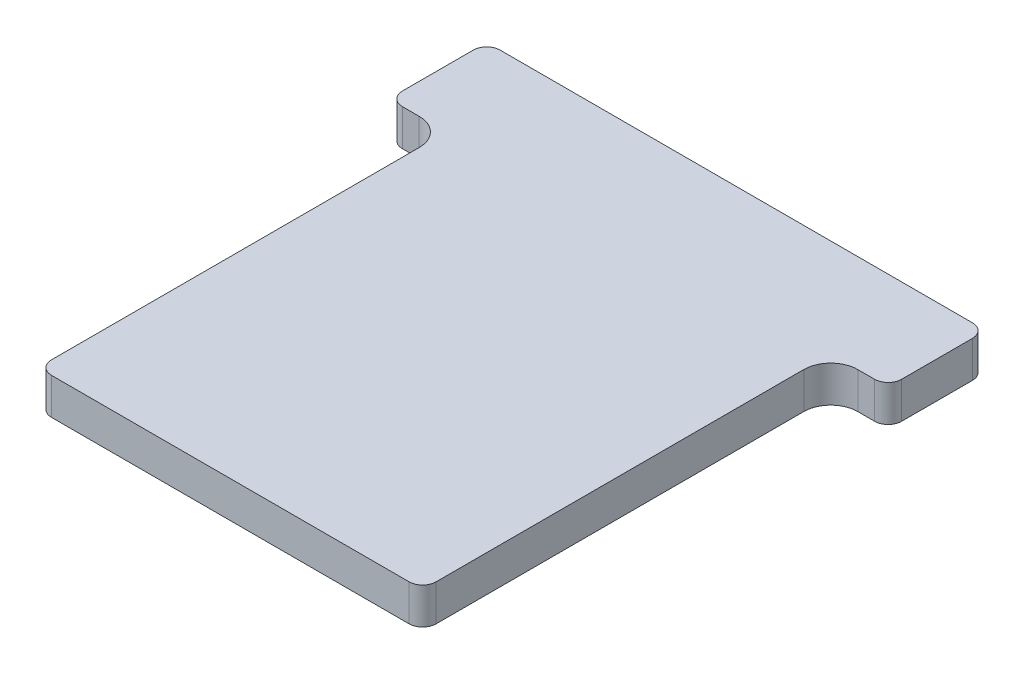
ISO-10303-21;
HEADER;
FILE_DESCRIPTION(('STEP AP214'),'2;1');
FILE_NAME('part.step','',(''),(''),'','','');
FILE_SCHEMA(('AUTOMOTIVE_DESIGN { 1 0 10303 214 1 1 1 1 }'));
ENDSEC;
DATA;
#1=APPLICATION_CONTEXT('core data for automotive mechanical design processes');
#2=APPLICATION_PROTOCOL_DEFINITION('international standard','automotive_design',2000,#1);
#3=PRODUCT_CONTEXT('',#1,'mechanical');
#4=PRODUCT('Part','Part','',(#3));
#5=PRODUCT_RELATED_PRODUCT_CATEGORY('part','',(#4));
#6=PRODUCT_DEFINITION_FORMATION('','',#4);
#7=PRODUCT_DEFINITION_CONTEXT('part definition',#1,'design');
#8=PRODUCT_DEFINITION('design','',#6,#7);
#9=PRODUCT_DEFINITION_SHAPE('','',#8);
#10=(LENGTH_UNIT() NAMED_UNIT(*) SI_UNIT(.MILLI.,.METRE.));
#11=(NAMED_UNIT(*) PLANE_ANGLE_UNIT() SI_UNIT($,.RADIAN.));
#12=(NAMED_UNIT(*) SI_UNIT($,.STERADIAN.) SOLID_ANGLE_UNIT());
#13=UNCERTAINTY_MEASURE_WITH_UNIT(LENGTH_MEASURE(1.E-05),#10,'distance_accuracy_value','');
#14=(GEOMETRIC_REPRESENTATION_CONTEXT(3) GLOBAL_UNCERTAINTY_ASSIGNED_CONTEXT((#13)) GLOBAL_UNIT_ASSIGNED_CONTEXT((#10,
#11,#12)) REPRESENTATION_CONTEXT('',''));
#15=CARTESIAN_POINT('',(0.,0.,0.));
#16=DIRECTION('',(0.,0.,1.));
#17=DIRECTION('',(1.,0.,0.));
#18=AXIS2_PLACEMENT_3D('',#15,#16,#17);
#19=CARTESIAN_POINT('',(14.25,2.7,-15.125));
#20=DIRECTION('',(0.,0.,-1.));
#21=DIRECTION('',(-1.,0.,0.));
#22=AXIS2_PLACEMENT_3D('',#19,#20,#21);
#23=PLANE('',#22);
#24=DIRECTION('',(1.,0.,0.));
#25=VECTOR('',#24,1.);
#26=CARTESIAN_POINT('',(14.25,2.7,-15.125));
#27=LINE('',#26,#25);
#28=CARTESIAN_POINT('',(16.25,2.7,-15.125));
#29=VERTEX_POINT('',#28);
#30=CARTESIAN_POINT('',(17.5,2.7,-15.125));
#31=VERTEX_POINT('',#30);
#32=EDGE_CURVE('E171',#29,#31,#27,.T.);
#33=ORIENTED_EDGE('',*,*,#32,.F.);
#34=DIRECTION('',(0.,-1.,0.));
#35=VECTOR('',#34,1.);
#36=CARTESIAN_POINT('',(16.25,0.,-15.125));
#37=LINE('',#36,#35);
#38=CARTESIAN_POINT('',(16.25,0.,-15.125));
#39=VERTEX_POINT('',#38);
#40=EDGE_CURVE('E229',#29,#39,#37,.T.);
#41=ORIENTED_EDGE('',*,*,#40,.T.);
#42=DIRECTION('',(1.,0.,0.));
#43=VECTOR('',#42,1.);
#44=CARTESIAN_POINT('',(14.25,0.,-15.125));
#45=LINE('',#44,#43);
#46=CARTESIAN_POINT('',(17.5,0.,-15.125));
#47=VERTEX_POINT('',#46);
#48=EDGE_CURVE('E309',#39,#47,#45,.T.);
#49=ORIENTED_EDGE('',*,*,#48,.T.);
#50=DIRECTION('',(0.,-1.,0.));
#51=VECTOR('',#50,1.);
#52=CARTESIAN_POINT('',(17.5,2.7,-15.125));
#53=LINE('',#52,#51);
#54=EDGE_CURVE('E218',#47,#31,#53,.F.);
#55=ORIENTED_EDGE('',*,*,#54,.T.);
#56=EDGE_LOOP('',(#33,#41,#49,#55));
#57=FACE_BOUND('',#56,.T.);
#58=ADVANCED_FACE('F33',(#57),#23,.F.);
#59=CARTESIAN_POINT('',(18.5,2.7,-22.375));
#60=DIRECTION('',(-1.,0.,0.));
#61=DIRECTION('',(0.,0.,1.));
#62=AXIS2_PLACEMENT_3D('',#59,#60,#61);
#63=PLANE('',#62);
#64=DIRECTION('',(0.,0.,-1.));
#65=VECTOR('',#64,1.);
#66=CARTESIAN_POINT('',(18.5,0.,-22.375));
#67=LINE('',#66,#65);
#68=CARTESIAN_POINT('',(18.5,0.,-16.125));
#69=VERTEX_POINT('',#68);
#70=CARTESIAN_POINT('',(18.5,0.,-21.375));
#71=VERTEX_POINT('',#70);
#72=EDGE_CURVE('E311',#69,#71,#67,.T.);
#73=ORIENTED_EDGE('',*,*,#72,.T.);
#74=DIRECTION('',(0.,-1.,0.));
#75=VECTOR('',#74,1.);
#76=CARTESIAN_POINT('',(18.5,2.7,-21.375));
#77=LINE('',#76,#75);
#78=CARTESIAN_POINT('',(18.5,2.7,-21.375));
#79=VERTEX_POINT('',#78);
#80=EDGE_CURVE('E216',#71,#79,#77,.F.);
#81=ORIENTED_EDGE('',*,*,#80,.T.);
#82=DIRECTION('',(0.,0.,-1.));
#83=VECTOR('',#82,1.);
#84=CARTESIAN_POINT('',(18.5,2.7,-22.375));
#85=LINE('',#84,#83);
#86=CARTESIAN_POINT('',(18.5,2.7,-16.125));
#87=VERTEX_POINT('',#86);
#88=EDGE_CURVE('E174',#87,#79,#85,.T.);
#89=ORIENTED_EDGE('',*,*,#88,.F.);
#90=DIRECTION('',(0.,-1.,0.));
#91=VECTOR('',#90,1.);
#92=CARTESIAN_POINT('',(18.5,2.7,-16.125));
#93=LINE('',#92,#91);
#94=EDGE_CURVE('E213',#87,#69,#93,.T.);
#95=ORIENTED_EDGE('',*,*,#94,.T.);
#96=EDGE_LOOP('',(#73,#81,#89,#95));
#97=FACE_BOUND('',#96,.T.);
#98=ADVANCED_FACE('F262',(#97),#63,.F.);
#99=CARTESIAN_POINT('',(-18.5,2.7,-22.375));
#100=DIRECTION('',(0.,0.,1.));
#101=DIRECTION('',(1.,0.,0.));
#102=AXIS2_PLACEMENT_3D('',#99,#100,#101);
#103=PLANE('',#102);
#104=DIRECTION('',(-1.,0.,0.));
#105=VECTOR('',#104,1.);
#106=CARTESIAN_POINT('',(-18.5,2.7,-22.375));
#107=LINE('',#106,#105);
#108=CARTESIAN_POINT('',(17.5,2.7,-22.375));
#109=VERTEX_POINT('',#108);
#110=CARTESIAN_POINT('',(-17.5,2.7,-22.375));
#111=VERTEX_POINT('',#110);
#112=EDGE_CURVE('E303',#109,#111,#107,.T.);
#113=ORIENTED_EDGE('',*,*,#112,.F.);
#114=DIRECTION('',(0.,-1.,0.));
#115=VECTOR('',#114,1.);
#116=CARTESIAN_POINT('',(17.5,2.7,-22.375));
#117=LINE('',#116,#115);
#118=CARTESIAN_POINT('',(17.5,0.,-22.375));
#119=VERTEX_POINT('',#118);
#120=EDGE_CURVE('E210',#109,#119,#117,.T.);
#121=ORIENTED_EDGE('',*,*,#120,.T.);
#122=DIRECTION('',(-1.,0.,0.));
#123=VECTOR('',#122,1.);
#124=CARTESIAN_POINT('',(-18.5,0.,-22.375));
#125=LINE('',#124,#123);
#126=CARTESIAN_POINT('',(-17.5,0.,-22.375));
#127=VERTEX_POINT('',#126);
#128=EDGE_CURVE('E314',#119,#127,#125,.T.);
#129=ORIENTED_EDGE('',*,*,#128,.T.);
#130=DIRECTION('',(0.,-1.,0.));
#131=VECTOR('',#130,1.);
#132=CARTESIAN_POINT('',(-17.5,2.7,-22.375));
#133=LINE('',#132,#131);
#134=EDGE_CURVE('E208',#127,#111,#133,.F.);
#135=ORIENTED_EDGE('',*,*,#134,.T.);
#136=EDGE_LOOP('',(#113,#121,#129,#135));
#137=FACE_BOUND('',#136,.T.);
#138=ADVANCED_FACE('F267',(#137),#103,.F.);
#139=CARTESIAN_POINT('',(-18.5,2.7,-22.375));
#140=DIRECTION('',(1.,0.,0.));
#141=DIRECTION('',(0.,0.,-1.));
#142=AXIS2_PLACEMENT_3D('',#139,#140,#141);
#143=PLANE('',#142);
#144=DIRECTION('',(0.,0.,1.));
#145=VECTOR('',#144,1.);
#146=CARTESIAN_POINT('',(-18.5,0.,-22.375));
#147=LINE('',#146,#145);
#148=CARTESIAN_POINT('',(-18.5,0.,-21.375));
#149=VERTEX_POINT('',#148);
#150=CARTESIAN_POINT('',(-18.5,0.,-16.125));
#151=VERTEX_POINT('',#150);
#152=EDGE_CURVE('E317',#149,#151,#147,.T.);
#153=ORIENTED_EDGE('',*,*,#152,.T.);
#154=DIRECTION('',(0.,-1.,0.));
#155=VECTOR('',#154,1.);
#156=CARTESIAN_POINT('',(-18.5,2.7,-16.125));
#157=LINE('',#156,#155);
#158=CARTESIAN_POINT('',(-18.5,2.7,-16.125));
#159=VERTEX_POINT('',#158);
#160=EDGE_CURVE('E227',#151,#159,#157,.F.);
#161=ORIENTED_EDGE('',*,*,#160,.T.);
#162=DIRECTION('',(0.,0.,1.));
#163=VECTOR('',#162,1.);
#164=CARTESIAN_POINT('',(-18.5,2.7,-22.375));
#165=LINE('',#164,#163);
#166=CARTESIAN_POINT('',(-18.5,2.7,-21.375));
#167=VERTEX_POINT('',#166);
#168=EDGE_CURVE('E297',#167,#159,#165,.T.);
#169=ORIENTED_EDGE('',*,*,#168,.F.);
#170=DIRECTION('',(0.,-1.,0.));
#171=VECTOR('',#170,1.);
#172=CARTESIAN_POINT('',(-18.5,2.7,-21.375));
#173=LINE('',#172,#171);
#174=EDGE_CURVE('E224',#167,#149,#173,.T.);
#175=ORIENTED_EDGE('',*,*,#174,.T.);
#176=EDGE_LOOP('',(#153,#161,#169,#175));
#177=FACE_BOUND('',#176,.T.);
#178=ADVANCED_FACE('F343',(#177),#143,.F.);
#179=CARTESIAN_POINT('',(-14.25,2.7,-15.125));
#180=DIRECTION('',(0.,0.,-1.));
#181=DIRECTION('',(-1.,0.,0.));
#182=AXIS2_PLACEMENT_3D('',#179,#180,#181);
#183=PLANE('',#182);
#184=DIRECTION('',(1.,0.,0.));
#185=VECTOR('',#184,1.);
#186=CARTESIAN_POINT('',(-14.25,0.,-15.125));
#187=LINE('',#186,#185);
#188=CARTESIAN_POINT('',(-17.5,0.,-15.125));
#189=VERTEX_POINT('',#188);
#190=CARTESIAN_POINT('',(-16.25,0.,-15.125));
#191=VERTEX_POINT('',#190);
#192=EDGE_CURVE('E320',#189,#191,#187,.T.);
#193=ORIENTED_EDGE('',*,*,#192,.T.);
#194=DIRECTION('',(0.,-1.,0.));
#195=VECTOR('',#194,1.);
#196=CARTESIAN_POINT('',(-16.25,2.7,-15.125));
#197=LINE('',#196,#195);
#198=CARTESIAN_POINT('',(-16.25,2.7,-15.125));
#199=VERTEX_POINT('',#198);
#200=EDGE_CURVE('E54',#191,#199,#197,.F.);
#201=ORIENTED_EDGE('',*,*,#200,.T.);
#202=DIRECTION('',(1.,0.,0.));
#203=VECTOR('',#202,1.);
#204=CARTESIAN_POINT('',(-14.25,2.7,-15.125));
#205=LINE('',#204,#203);
#206=CARTESIAN_POINT('',(-17.5,2.7,-15.125));
#207=VERTEX_POINT('',#206);
#208=EDGE_CURVE('E294',#207,#199,#205,.T.);
#209=ORIENTED_EDGE('',*,*,#208,.F.);
#210=DIRECTION('',(0.,-1.,0.));
#211=VECTOR('',#210,1.);
#212=CARTESIAN_POINT('',(-17.5,2.7,-15.125));
#213=LINE('',#212,#211);
#214=EDGE_CURVE('E221',#207,#189,#213,.T.);
#215=ORIENTED_EDGE('',*,*,#214,.T.);
#216=EDGE_LOOP('',(#193,#201,#209,#215));
#217=FACE_BOUND('',#216,.T.);
#218=ADVANCED_FACE('F298',(#217),#183,.F.);
#219=CARTESIAN_POINT('',(-14.25,2.7,15.125));
#220=DIRECTION('',(1.,0.,0.));
#221=DIRECTION('',(0.,0.,-1.));
#222=AXIS2_PLACEMENT_3D('',#219,#220,#221);
#223=PLANE('',#222);
#224=DIRECTION('',(0.,0.,1.));
#225=VECTOR('',#224,1.);
#226=CARTESIAN_POINT('',(-14.25,2.7,15.125));
#227=LINE('',#226,#225);
#228=CARTESIAN_POINT('',(-14.25,2.7,-13.125));
#229=VERTEX_POINT('',#228);
#230=CARTESIAN_POINT('',(-14.25,2.7,14.125));
#231=VERTEX_POINT('',#230);
#232=EDGE_CURVE('E299',#229,#231,#227,.T.);
#233=ORIENTED_EDGE('',*,*,#232,.F.);
#234=DIRECTION('',(0.,-1.,0.));
#235=VECTOR('',#234,1.);
#236=CARTESIAN_POINT('',(-14.25,0.,-13.125));
#237=LINE('',#236,#235);
#238=CARTESIAN_POINT('',(-14.25,0.,-13.125));
#239=VERTEX_POINT('',#238);
#240=EDGE_CURVE('E234',#229,#239,#237,.T.);
#241=ORIENTED_EDGE('',*,*,#240,.T.);
#242=DIRECTION('',(0.,0.,1.));
#243=VECTOR('',#242,1.);
#244=CARTESIAN_POINT('',(-14.25,0.,15.125));
#245=LINE('',#244,#243);
#246=CARTESIAN_POINT('',(-14.25,0.,14.125));
#247=VERTEX_POINT('',#246);
#248=EDGE_CURVE('E176',#239,#247,#245,.T.);
#249=ORIENTED_EDGE('',*,*,#248,.T.);
#250=DIRECTION('',(0.,-1.,0.));
#251=VECTOR('',#250,1.);
#252=CARTESIAN_POINT('',(-14.25,2.7,14.125));
#253=LINE('',#252,#251);
#254=EDGE_CURVE('E205',#247,#231,#253,.F.);
#255=ORIENTED_EDGE('',*,*,#254,.T.);
#256=EDGE_LOOP('',(#233,#241,#249,#255));
#257=FACE_BOUND('',#256,.T.);
#258=ADVANCED_FACE('F323',(#257),#223,.F.);
#259=CARTESIAN_POINT('',(-14.25,2.7,15.125));
#260=DIRECTION('',(0.,0.,-1.));
#261=DIRECTION('',(-1.,0.,0.));
#262=AXIS2_PLACEMENT_3D('',#259,#260,#261);
#263=PLANE('',#262);
#264=DIRECTION('',(1.,0.,0.));
#265=VECTOR('',#264,1.);
#266=CARTESIAN_POINT('',(-14.25,0.,15.125));
#267=LINE('',#266,#265);
#268=CARTESIAN_POINT('',(-13.25,0.,15.125));
#269=VERTEX_POINT('',#268);
#270=CARTESIAN_POINT('',(13.25,0.,15.125));
#271=VERTEX_POINT('',#270);
#272=EDGE_CURVE('E172',#269,#271,#267,.T.);
#273=ORIENTED_EDGE('',*,*,#272,.T.);
#274=DIRECTION('',(0.,-1.,0.));
#275=VECTOR('',#274,1.);
#276=CARTESIAN_POINT('',(13.25,2.7,15.125));
#277=LINE('',#276,#275);
#278=CARTESIAN_POINT('',(13.25,2.7,15.125));
#279=VERTEX_POINT('',#278);
#280=EDGE_CURVE('E151',#271,#279,#277,.F.);
#281=ORIENTED_EDGE('',*,*,#280,.T.);
#282=DIRECTION('',(1.,0.,0.));
#283=VECTOR('',#282,1.);
#284=CARTESIAN_POINT('',(-14.25,2.7,15.125));
#285=LINE('',#284,#283);
#286=CARTESIAN_POINT('',(-13.25,2.7,15.125));
#287=VERTEX_POINT('',#286);
#288=EDGE_CURVE('E301',#287,#279,#285,.T.);
#289=ORIENTED_EDGE('',*,*,#288,.F.);
#290=DIRECTION('',(0.,-1.,0.));
#291=VECTOR('',#290,1.);
#292=CARTESIAN_POINT('',(-13.25,2.7,15.125));
#293=LINE('',#292,#291);
#294=EDGE_CURVE('E155',#287,#269,#293,.T.);
#295=ORIENTED_EDGE('',*,*,#294,.T.);
#296=EDGE_LOOP('',(#273,#281,#289,#295));
#297=FACE_BOUND('',#296,.T.);
#298=ADVANCED_FACE('F330',(#297),#263,.F.);
#299=CARTESIAN_POINT('',(14.25,2.7,15.125));
#300=DIRECTION('',(-1.,0.,0.));
#301=DIRECTION('',(0.,0.,1.));
#302=AXIS2_PLACEMENT_3D('',#299,#300,#301);
#303=PLANE('',#302);
#304=DIRECTION('',(0.,0.,-1.));
#305=VECTOR('',#304,1.);
#306=CARTESIAN_POINT('',(14.25,0.,15.125));
#307=LINE('',#306,#305);
#308=CARTESIAN_POINT('',(14.25,0.,14.125));
#309=VERTEX_POINT('',#308);
#310=CARTESIAN_POINT('',(14.25,0.,-13.125));
#311=VERTEX_POINT('',#310);
#312=EDGE_CURVE('E162',#309,#311,#307,.T.);
#313=ORIENTED_EDGE('',*,*,#312,.T.);
#314=DIRECTION('',(0.,-1.,0.));
#315=VECTOR('',#314,1.);
#316=CARTESIAN_POINT('',(14.25,2.7,-13.125));
#317=LINE('',#316,#315);
#318=CARTESIAN_POINT('',(14.25,2.7,-13.125));
#319=VERTEX_POINT('',#318);
#320=EDGE_CURVE('E232',#311,#319,#317,.F.);
#321=ORIENTED_EDGE('',*,*,#320,.T.);
#322=DIRECTION('',(0.,0.,-1.));
#323=VECTOR('',#322,1.);
#324=CARTESIAN_POINT('',(14.25,2.7,15.125));
#325=LINE('',#324,#323);
#326=CARTESIAN_POINT('',(14.25,2.7,14.125));
#327=VERTEX_POINT('',#326);
#328=EDGE_CURVE('E165',#327,#319,#325,.T.);
#329=ORIENTED_EDGE('',*,*,#328,.F.);
#330=DIRECTION('',(0.,-1.,0.));
#331=VECTOR('',#330,1.);
#332=CARTESIAN_POINT('',(14.25,2.7,14.125));
#333=LINE('',#332,#331);
#334=EDGE_CURVE('E150',#327,#309,#333,.T.);
#335=ORIENTED_EDGE('',*,*,#334,.T.);
#336=EDGE_LOOP('',(#313,#321,#329,#335));
#337=FACE_BOUND('',#336,.T.);
#338=ADVANCED_FACE('F161',(#337),#303,.F.);
#339=CARTESIAN_POINT('',(18.5,2.7,-15.125));
#340=DIRECTION('',(0.,-1.,0.));
#341=DIRECTION('',(0.,0.,-1.));
#342=AXIS2_PLACEMENT_3D('',#339,#340,#341);
#343=PLANE('',#342);
#344=ORIENTED_EDGE('',*,*,#288,.T.);
#345=CARTESIAN_POINT('',(13.25,2.7,14.125));
#346=DIRECTION('',(0.,-1.,0.));
#347=DIRECTION('',(0.,0.,-1.));
#348=AXIS2_PLACEMENT_3D('',#345,#346,#347);
#349=CIRCLE('',#348,1.);
#350=EDGE_CURVE('E203',#279,#327,#349,.F.);
#351=ORIENTED_EDGE('',*,*,#350,.T.);
#352=ORIENTED_EDGE('',*,*,#328,.T.);
#353=CARTESIAN_POINT('',(16.25,2.7,-13.125));
#354=DIRECTION('',(0.,-1.,0.));
#355=DIRECTION('',(0.,0.,-1.));
#356=AXIS2_PLACEMENT_3D('',#353,#354,#355);
#357=CIRCLE('',#356,2.);
#358=EDGE_CURVE('E239',#319,#29,#357,.T.);
#359=ORIENTED_EDGE('',*,*,#358,.T.);
#360=ORIENTED_EDGE('',*,*,#32,.T.);
#361=CARTESIAN_POINT('',(17.5,2.7,-16.125));
#362=DIRECTION('',(0.,-1.,0.));
#363=DIRECTION('',(0.,0.,-1.));
#364=AXIS2_PLACEMENT_3D('',#361,#362,#363);
#365=CIRCLE('',#364,1.);
#366=EDGE_CURVE('E197',#31,#87,#365,.F.);
#367=ORIENTED_EDGE('',*,*,#366,.T.);
#368=ORIENTED_EDGE('',*,*,#88,.T.);
#369=CARTESIAN_POINT('',(17.5,2.7,-21.375));
#370=DIRECTION('',(0.,-1.,0.));
#371=DIRECTION('',(0.,0.,-1.));
#372=AXIS2_PLACEMENT_3D('',#369,#370,#371);
#373=CIRCLE('',#372,1.);
#374=EDGE_CURVE('E199',#79,#109,#373,.F.);
#375=ORIENTED_EDGE('',*,*,#374,.T.);
#376=ORIENTED_EDGE('',*,*,#112,.T.);
#377=CARTESIAN_POINT('',(-17.5,2.7,-21.375));
#378=DIRECTION('',(0.,-1.,0.));
#379=DIRECTION('',(0.,0.,-1.));
#380=AXIS2_PLACEMENT_3D('',#377,#378,#379);
#381=CIRCLE('',#380,1.);
#382=EDGE_CURVE('E193',#111,#167,#381,.F.);
#383=ORIENTED_EDGE('',*,*,#382,.T.);
#384=ORIENTED_EDGE('',*,*,#168,.T.);
#385=CARTESIAN_POINT('',(-17.5,2.7,-16.125));
#386=DIRECTION('',(0.,-1.,0.));
#387=DIRECTION('',(0.,0.,-1.));
#388=AXIS2_PLACEMENT_3D('',#385,#386,#387);
#389=CIRCLE('',#388,1.);
#390=EDGE_CURVE('E195',#159,#207,#389,.F.);
#391=ORIENTED_EDGE('',*,*,#390,.T.);
#392=ORIENTED_EDGE('',*,*,#208,.T.);
#393=CARTESIAN_POINT('',(-16.25,2.7,-13.125));
#394=DIRECTION('',(0.,-1.,0.));
#395=DIRECTION('',(0.,0.,-1.));
#396=AXIS2_PLACEMENT_3D('',#393,#394,#395);
#397=CIRCLE('',#396,2.);
#398=EDGE_CURVE('E11',#199,#229,#397,.T.);
#399=ORIENTED_EDGE('',*,*,#398,.T.);
#400=ORIENTED_EDGE('',*,*,#232,.T.);
#401=CARTESIAN_POINT('',(-13.25,2.7,14.125));
#402=DIRECTION('',(0.,-1.,0.));
#403=DIRECTION('',(0.,0.,-1.));
#404=AXIS2_PLACEMENT_3D('',#401,#402,#403);
#405=CIRCLE('',#404,1.);
#406=EDGE_CURVE('E201',#231,#287,#405,.F.);
#407=ORIENTED_EDGE('',*,*,#406,.T.);
#408=EDGE_LOOP('',(#344,#351,#352,#359,#360,#367,#368,#375,#376,#383,#384,#391,#392,#399,#400,#407));
#409=FACE_BOUND('',#408,.T.);
#410=ADVANCED_FACE('F244',(#409),#343,.F.);
#411=CARTESIAN_POINT('',(18.5,0.,-15.125));
#412=DIRECTION('',(0.,-1.,0.));
#413=DIRECTION('',(0.,0.,-1.));
#414=AXIS2_PLACEMENT_3D('',#411,#412,#413);
#415=PLANE('',#414);
#416=ORIENTED_EDGE('',*,*,#312,.F.);
#417=CARTESIAN_POINT('',(13.25,0.,14.125));
#418=DIRECTION('',(0.,-1.,0.));
#419=DIRECTION('',(0.,0.,-1.));
#420=AXIS2_PLACEMENT_3D('',#417,#418,#419);
#421=CIRCLE('',#420,1.);
#422=EDGE_CURVE('E146',#309,#271,#421,.T.);
#423=ORIENTED_EDGE('',*,*,#422,.T.);
#424=ORIENTED_EDGE('',*,*,#272,.F.);
#425=CARTESIAN_POINT('',(-13.25,0.,14.125));
#426=DIRECTION('',(0.,-1.,0.));
#427=DIRECTION('',(0.,0.,-1.));
#428=AXIS2_PLACEMENT_3D('',#425,#426,#427);
#429=CIRCLE('',#428,1.);
#430=EDGE_CURVE('E156',#269,#247,#429,.T.);
#431=ORIENTED_EDGE('',*,*,#430,.T.);
#432=ORIENTED_EDGE('',*,*,#248,.F.);
#433=CARTESIAN_POINT('',(-16.25,0.,-13.125));
#434=DIRECTION('',(0.,-1.,0.));
#435=DIRECTION('',(0.,0.,-1.));
#436=AXIS2_PLACEMENT_3D('',#433,#434,#435);
#437=CIRCLE('',#436,2.);
#438=EDGE_CURVE('E41',#239,#191,#437,.F.);
#439=ORIENTED_EDGE('',*,*,#438,.T.);
#440=ORIENTED_EDGE('',*,*,#192,.F.);
#441=CARTESIAN_POINT('',(-17.5,0.,-16.125));
#442=DIRECTION('',(0.,-1.,0.));
#443=DIRECTION('',(0.,0.,-1.));
#444=AXIS2_PLACEMENT_3D('',#441,#442,#443);
#445=CIRCLE('',#444,1.);
#446=EDGE_CURVE('E181',#189,#151,#445,.T.);
#447=ORIENTED_EDGE('',*,*,#446,.T.);
#448=ORIENTED_EDGE('',*,*,#152,.F.);
#449=CARTESIAN_POINT('',(-17.5,0.,-21.375));
#450=DIRECTION('',(0.,-1.,0.));
#451=DIRECTION('',(0.,0.,-1.));
#452=AXIS2_PLACEMENT_3D('',#449,#450,#451);
#453=CIRCLE('',#452,1.);
#454=EDGE_CURVE('E166',#149,#127,#453,.T.);
#455=ORIENTED_EDGE('',*,*,#454,.T.);
#456=ORIENTED_EDGE('',*,*,#128,.F.);
#457=CARTESIAN_POINT('',(17.5,0.,-21.375));
#458=DIRECTION('',(0.,-1.,0.));
#459=DIRECTION('',(0.,0.,-1.));
#460=AXIS2_PLACEMENT_3D('',#457,#458,#459);
#461=CIRCLE('',#460,1.);
#462=EDGE_CURVE('E186',#119,#71,#461,.T.);
#463=ORIENTED_EDGE('',*,*,#462,.T.);
#464=ORIENTED_EDGE('',*,*,#72,.F.);
#465=CARTESIAN_POINT('',(17.5,0.,-16.125));
#466=DIRECTION('',(0.,-1.,0.));
#467=DIRECTION('',(0.,0.,-1.));
#468=AXIS2_PLACEMENT_3D('',#465,#466,#467);
#469=CIRCLE('',#468,1.);
#470=EDGE_CURVE('E183',#69,#47,#469,.T.);
#471=ORIENTED_EDGE('',*,*,#470,.T.);
#472=ORIENTED_EDGE('',*,*,#48,.F.);
#473=CARTESIAN_POINT('',(16.25,0.,-13.125));
#474=DIRECTION('',(0.,-1.,0.));
#475=DIRECTION('',(0.,0.,-1.));
#476=AXIS2_PLACEMENT_3D('',#473,#474,#475);
#477=CIRCLE('',#476,2.);
#478=EDGE_CURVE('E170',#39,#311,#477,.F.);
#479=ORIENTED_EDGE('',*,*,#478,.T.);
#480=EDGE_LOOP('',(#416,#423,#424,#431,#432,#439,#440,#447,#448,#455,#456,#463,#464,#471,#472,#479));
#481=FACE_BOUND('',#480,.T.);
#482=ADVANCED_FACE('F168',(#481),#415,.T.);
#483=CARTESIAN_POINT('',(13.25,2.7,14.125));
#484=DIRECTION('',(0.,-1.,0.));
#485=DIRECTION('',(0.,0.,-1.));
#486=AXIS2_PLACEMENT_3D('',#483,#484,#485);
#487=CYLINDRICAL_SURFACE('',#486,1.);
#488=ORIENTED_EDGE('',*,*,#350,.F.);
#489=ORIENTED_EDGE('',*,*,#280,.F.);
#490=ORIENTED_EDGE('',*,*,#422,.F.);
#491=ORIENTED_EDGE('',*,*,#334,.F.);
#492=EDGE_LOOP('',(#488,#489,#490,#491));
#493=FACE_BOUND('',#492,.T.);
#494=ADVANCED_FACE('F149',(#493),#487,.T.);
#495=CARTESIAN_POINT('',(-13.25,2.7,14.125));
#496=DIRECTION('',(0.,-1.,0.));
#497=DIRECTION('',(0.,0.,-1.));
#498=AXIS2_PLACEMENT_3D('',#495,#496,#497);
#499=CYLINDRICAL_SURFACE('',#498,1.);
#500=ORIENTED_EDGE('',*,*,#406,.F.);
#501=ORIENTED_EDGE('',*,*,#254,.F.);
#502=ORIENTED_EDGE('',*,*,#430,.F.);
#503=ORIENTED_EDGE('',*,*,#294,.F.);
#504=EDGE_LOOP('',(#500,#501,#502,#503));
#505=FACE_BOUND('',#504,.T.);
#506=ADVANCED_FACE('F274',(#505),#499,.T.);
#507=CARTESIAN_POINT('',(17.5,2.7,-21.375));
#508=DIRECTION('',(0.,-1.,0.));
#509=DIRECTION('',(0.,0.,-1.));
#510=AXIS2_PLACEMENT_3D('',#507,#508,#509);
#511=CYLINDRICAL_SURFACE('',#510,1.);
#512=ORIENTED_EDGE('',*,*,#374,.F.);
#513=ORIENTED_EDGE('',*,*,#80,.F.);
#514=ORIENTED_EDGE('',*,*,#462,.F.);
#515=ORIENTED_EDGE('',*,*,#120,.F.);
#516=EDGE_LOOP('',(#512,#513,#514,#515));
#517=FACE_BOUND('',#516,.T.);
#518=ADVANCED_FACE('F277',(#517),#511,.T.);
#519=CARTESIAN_POINT('',(17.5,2.7,-16.125));
#520=DIRECTION('',(0.,-1.,0.));
#521=DIRECTION('',(0.,0.,-1.));
#522=AXIS2_PLACEMENT_3D('',#519,#520,#521);
#523=CYLINDRICAL_SURFACE('',#522,1.);
#524=ORIENTED_EDGE('',*,*,#366,.F.);
#525=ORIENTED_EDGE('',*,*,#54,.F.);
#526=ORIENTED_EDGE('',*,*,#470,.F.);
#527=ORIENTED_EDGE('',*,*,#94,.F.);
#528=EDGE_LOOP('',(#524,#525,#526,#527));
#529=FACE_BOUND('',#528,.T.);
#530=ADVANCED_FACE('F281',(#529),#523,.T.);
#531=CARTESIAN_POINT('',(-17.5,2.7,-16.125));
#532=DIRECTION('',(0.,-1.,0.));
#533=DIRECTION('',(0.,0.,-1.));
#534=AXIS2_PLACEMENT_3D('',#531,#532,#533);
#535=CYLINDRICAL_SURFACE('',#534,1.);
#536=ORIENTED_EDGE('',*,*,#390,.F.);
#537=ORIENTED_EDGE('',*,*,#160,.F.);
#538=ORIENTED_EDGE('',*,*,#446,.F.);
#539=ORIENTED_EDGE('',*,*,#214,.F.);
#540=EDGE_LOOP('',(#536,#537,#538,#539));
#541=FACE_BOUND('',#540,.T.);
#542=ADVANCED_FACE('F258',(#541),#535,.T.);
#543=CARTESIAN_POINT('',(-17.5,2.7,-21.375));
#544=DIRECTION('',(0.,-1.,0.));
#545=DIRECTION('',(0.,0.,-1.));
#546=AXIS2_PLACEMENT_3D('',#543,#544,#545);
#547=CYLINDRICAL_SURFACE('',#546,1.);
#548=ORIENTED_EDGE('',*,*,#382,.F.);
#549=ORIENTED_EDGE('',*,*,#134,.F.);
#550=ORIENTED_EDGE('',*,*,#454,.F.);
#551=ORIENTED_EDGE('',*,*,#174,.F.);
#552=EDGE_LOOP('',(#548,#549,#550,#551));
#553=FACE_BOUND('',#552,.T.);
#554=ADVANCED_FACE('F252',(#553),#547,.T.);
#555=CARTESIAN_POINT('',(16.25,2.7,-13.125));
#556=DIRECTION('',(0.,1.,0.));
#557=DIRECTION('',(0.,0.,1.));
#558=AXIS2_PLACEMENT_3D('',#555,#556,#557);
#559=CYLINDRICAL_SURFACE('',#558,2.);
#560=ORIENTED_EDGE('',*,*,#358,.F.);
#561=ORIENTED_EDGE('',*,*,#320,.F.);
#562=ORIENTED_EDGE('',*,*,#478,.F.);
#563=ORIENTED_EDGE('',*,*,#40,.F.);
#564=EDGE_LOOP('',(#560,#561,#562,#563));
#565=FACE_BOUND('',#564,.T.);
#566=ADVANCED_FACE('F250',(#565),#559,.F.);
#567=CARTESIAN_POINT('',(-16.25,2.7,-13.125));
#568=DIRECTION('',(0.,1.,0.));
#569=DIRECTION('',(0.,0.,1.));
#570=AXIS2_PLACEMENT_3D('',#567,#568,#569);
#571=CYLINDRICAL_SURFACE('',#570,2.);
#572=ORIENTED_EDGE('',*,*,#398,.F.);
#573=ORIENTED_EDGE('',*,*,#200,.F.);
#574=ORIENTED_EDGE('',*,*,#438,.F.);
#575=ORIENTED_EDGE('',*,*,#240,.F.);
#576=EDGE_LOOP('',(#572,#573,#574,#575));
#577=FACE_BOUND('',#576,.T.);
#578=ADVANCED_FACE('F35',(#577),#571,.F.);
#579=CLOSED_SHELL('',(#58,#98,#138,#178,#218,#258,#298,#338,#410,#482,#494,#506,#518,#530,#542,
#554,#566,#578));
#580=MANIFOLD_SOLID_BREP('B2',#579);
#581=ADVANCED_BREP_SHAPE_REPRESENTATION('',(#18,#580),#14);
#582=SHAPE_DEFINITION_REPRESENTATION(#9,#581);
ENDSEC;
END-ISO-10303-21;
